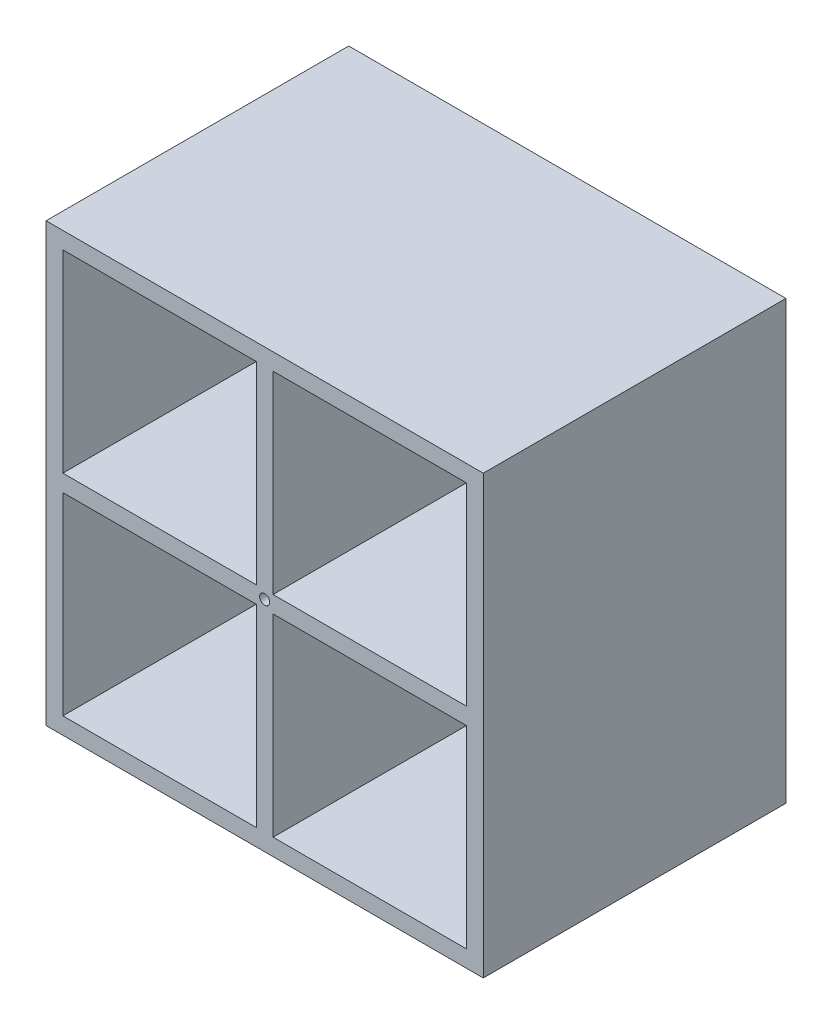
ISO-10303-21;
HEADER;
FILE_DESCRIPTION(('STEP AP214'),'2;1');
FILE_NAME('part.step','',(''),(''),'','','');
FILE_SCHEMA(('AUTOMOTIVE_DESIGN { 1 0 10303 214 1 1 1 1 }'));
ENDSEC;
DATA;
#1=APPLICATION_CONTEXT('core data for automotive mechanical design processes');
#2=APPLICATION_PROTOCOL_DEFINITION('international standard','automotive_design',2000,#1);
#3=PRODUCT_CONTEXT('',#1,'mechanical');
#4=PRODUCT('Part','Part','',(#3));
#5=PRODUCT_RELATED_PRODUCT_CATEGORY('part','',(#4));
#6=PRODUCT_DEFINITION_FORMATION('','',#4);
#7=PRODUCT_DEFINITION_CONTEXT('part definition',#1,'design');
#8=PRODUCT_DEFINITION('design','',#6,#7);
#9=PRODUCT_DEFINITION_SHAPE('','',#8);
#10=(LENGTH_UNIT() NAMED_UNIT(*) SI_UNIT(.MILLI.,.METRE.));
#11=(NAMED_UNIT(*) PLANE_ANGLE_UNIT() SI_UNIT($,.RADIAN.));
#12=(NAMED_UNIT(*) SI_UNIT($,.STERADIAN.) SOLID_ANGLE_UNIT());
#13=UNCERTAINTY_MEASURE_WITH_UNIT(LENGTH_MEASURE(1.E-05),#10,'distance_accuracy_value','');
#14=(GEOMETRIC_REPRESENTATION_CONTEXT(3) GLOBAL_UNCERTAINTY_ASSIGNED_CONTEXT((#13)) GLOBAL_UNIT_ASSIGNED_CONTEXT((#10,
#11,#12)) REPRESENTATION_CONTEXT('',''));
#15=CARTESIAN_POINT('',(0.,0.,0.));
#16=DIRECTION('',(0.,0.,1.));
#17=DIRECTION('',(1.,0.,0.));
#18=AXIS2_PLACEMENT_3D('',#15,#16,#17);
#19=CARTESIAN_POINT('',(65.,65.,90.));
#20=DIRECTION('',(-1.,0.,0.));
#21=DIRECTION('',(0.,-1.,0.));
#22=AXIS2_PLACEMENT_3D('',#19,#20,#21);
#23=PLANE('',#22);
#24=DIRECTION('',(0.,1.,0.));
#25=VECTOR('',#24,1.);
#26=CARTESIAN_POINT('',(65.,65.,0.));
#27=LINE('',#26,#25);
#28=CARTESIAN_POINT('',(65.,-65.,0.));
#29=VERTEX_POINT('',#28);
#30=CARTESIAN_POINT('',(65.,65.,0.));
#31=VERTEX_POINT('',#30);
#32=EDGE_CURVE('E301',#29,#31,#27,.T.);
#33=ORIENTED_EDGE('',*,*,#32,.T.);
#34=DIRECTION('',(0.,0.,-1.));
#35=VECTOR('',#34,1.);
#36=CARTESIAN_POINT('',(65.,65.,90.));
#37=LINE('',#36,#35);
#38=CARTESIAN_POINT('',(65.,65.,90.));
#39=VERTEX_POINT('',#38);
#40=EDGE_CURVE('E11',#39,#31,#37,.T.);
#41=ORIENTED_EDGE('',*,*,#40,.F.);
#42=DIRECTION('',(0.,1.,0.));
#43=VECTOR('',#42,1.);
#44=CARTESIAN_POINT('',(65.,65.,90.));
#45=LINE('',#44,#43);
#46=CARTESIAN_POINT('',(65.,-65.,90.));
#47=VERTEX_POINT('',#46);
#48=EDGE_CURVE('E308',#47,#39,#45,.T.);
#49=ORIENTED_EDGE('',*,*,#48,.F.);
#50=DIRECTION('',(0.,0.,-1.));
#51=VECTOR('',#50,1.);
#52=CARTESIAN_POINT('',(65.,-65.,90.));
#53=LINE('',#52,#51);
#54=EDGE_CURVE('E318',#47,#29,#53,.T.);
#55=ORIENTED_EDGE('',*,*,#54,.T.);
#56=EDGE_LOOP('',(#33,#41,#49,#55));
#57=FACE_BOUND('',#56,.T.);
#58=ADVANCED_FACE('F39',(#57),#23,.F.);
#59=CARTESIAN_POINT('',(-65.,65.,90.));
#60=DIRECTION('',(0.,-1.,0.));
#61=DIRECTION('',(0.,0.,-1.));
#62=AXIS2_PLACEMENT_3D('',#59,#60,#61);
#63=PLANE('',#62);
#64=DIRECTION('',(-1.,0.,0.));
#65=VECTOR('',#64,1.);
#66=CARTESIAN_POINT('',(-65.,65.,0.));
#67=LINE('',#66,#65);
#68=CARTESIAN_POINT('',(-65.,65.,0.));
#69=VERTEX_POINT('',#68);
#70=EDGE_CURVE('E321',#31,#69,#67,.T.);
#71=ORIENTED_EDGE('',*,*,#70,.T.);
#72=DIRECTION('',(0.,0.,-1.));
#73=VECTOR('',#72,1.);
#74=CARTESIAN_POINT('',(-65.,65.,90.));
#75=LINE('',#74,#73);
#76=CARTESIAN_POINT('',(-65.,65.,90.));
#77=VERTEX_POINT('',#76);
#78=EDGE_CURVE('E46',#77,#69,#75,.T.);
#79=ORIENTED_EDGE('',*,*,#78,.F.);
#80=DIRECTION('',(-1.,0.,0.));
#81=VECTOR('',#80,1.);
#82=CARTESIAN_POINT('',(-65.,65.,90.));
#83=LINE('',#82,#81);
#84=EDGE_CURVE('E311',#39,#77,#83,.T.);
#85=ORIENTED_EDGE('',*,*,#84,.F.);
#86=ORIENTED_EDGE('',*,*,#40,.T.);
#87=EDGE_LOOP('',(#71,#79,#85,#86));
#88=FACE_BOUND('',#87,.T.);
#89=ADVANCED_FACE('F350',(#88),#63,.F.);
#90=CARTESIAN_POINT('',(-65.,65.,90.));
#91=DIRECTION('',(1.,0.,0.));
#92=DIRECTION('',(0.,1.,0.));
#93=AXIS2_PLACEMENT_3D('',#90,#91,#92);
#94=PLANE('',#93);
#95=DIRECTION('',(0.,-1.,0.));
#96=VECTOR('',#95,1.);
#97=CARTESIAN_POINT('',(-65.,65.,0.));
#98=LINE('',#97,#96);
#99=CARTESIAN_POINT('',(-65.,-65.,0.));
#100=VERTEX_POINT('',#99);
#101=EDGE_CURVE('E323',#69,#100,#98,.T.);
#102=ORIENTED_EDGE('',*,*,#101,.T.);
#103=DIRECTION('',(0.,0.,-1.));
#104=VECTOR('',#103,1.);
#105=CARTESIAN_POINT('',(-65.,-65.,90.));
#106=LINE('',#105,#104);
#107=CARTESIAN_POINT('',(-65.,-65.,90.));
#108=VERTEX_POINT('',#107);
#109=EDGE_CURVE('E328',#108,#100,#106,.T.);
#110=ORIENTED_EDGE('',*,*,#109,.F.);
#111=DIRECTION('',(0.,-1.,0.));
#112=VECTOR('',#111,1.);
#113=CARTESIAN_POINT('',(-65.,65.,90.));
#114=LINE('',#113,#112);
#115=EDGE_CURVE('E314',#77,#108,#114,.T.);
#116=ORIENTED_EDGE('',*,*,#115,.F.);
#117=ORIENTED_EDGE('',*,*,#78,.T.);
#118=EDGE_LOOP('',(#102,#110,#116,#117));
#119=FACE_BOUND('',#118,.T.);
#120=ADVANCED_FACE('F335',(#119),#94,.F.);
#121=CARTESIAN_POINT('',(-65.,-65.,90.));
#122=DIRECTION('',(0.,1.,0.));
#123=DIRECTION('',(0.,0.,1.));
#124=AXIS2_PLACEMENT_3D('',#121,#122,#123);
#125=PLANE('',#124);
#126=DIRECTION('',(1.,0.,0.));
#127=VECTOR('',#126,1.);
#128=CARTESIAN_POINT('',(-65.,-65.,0.));
#129=LINE('',#128,#127);
#130=EDGE_CURVE('E312',#100,#29,#129,.T.);
#131=ORIENTED_EDGE('',*,*,#130,.T.);
#132=ORIENTED_EDGE('',*,*,#54,.F.);
#133=DIRECTION('',(1.,0.,0.));
#134=VECTOR('',#133,1.);
#135=CARTESIAN_POINT('',(-65.,-65.,90.));
#136=LINE('',#135,#134);
#137=EDGE_CURVE('E316',#108,#47,#136,.T.);
#138=ORIENTED_EDGE('',*,*,#137,.F.);
#139=ORIENTED_EDGE('',*,*,#109,.T.);
#140=EDGE_LOOP('',(#131,#132,#138,#139));
#141=FACE_BOUND('',#140,.T.);
#142=ADVANCED_FACE('F344',(#141),#125,.F.);
#143=CARTESIAN_POINT('',(0.,0.,90.));
#144=DIRECTION('',(0.,0.,1.));
#145=DIRECTION('',(1.,0.,0.));
#146=AXIS2_PLACEMENT_3D('',#143,#144,#145);
#147=PLANE('',#146);
#148=CARTESIAN_POINT('',(0.,0.,90.));
#149=DIRECTION('',(0.,0.,1.));
#150=DIRECTION('',(1.,0.,0.));
#151=AXIS2_PLACEMENT_3D('',#148,#149,#150);
#152=CIRCLE('',#151,1.5);
#153=CARTESIAN_POINT('',(1.5,0.,90.));
#154=VERTEX_POINT('',#153);
#155=EDGE_CURVE('E434',#154,#154,#152,.T.);
#156=ORIENTED_EDGE('',*,*,#155,.F.);
#157=EDGE_LOOP('',(#156));
#158=FACE_BOUND('',#157,.T.);
#159=DIRECTION('',(0.,-1.,0.));
#160=VECTOR('',#159,1.);
#161=CARTESIAN_POINT('',(2.50000000000003,2.5,90.));
#162=LINE('',#161,#160);
#163=CARTESIAN_POINT('',(2.50000000000003,60.,90.));
#164=VERTEX_POINT('',#163);
#165=CARTESIAN_POINT('',(2.50000000000003,2.5,90.));
#166=VERTEX_POINT('',#165);
#167=EDGE_CURVE('E53',#164,#166,#162,.T.);
#168=ORIENTED_EDGE('',*,*,#167,.F.);
#169=DIRECTION('',(-1.,0.,0.));
#170=VECTOR('',#169,1.);
#171=CARTESIAN_POINT('',(2.50000000000003,60.,90.));
#172=LINE('',#171,#170);
#173=CARTESIAN_POINT('',(60.,60.,90.));
#174=VERTEX_POINT('',#173);
#175=EDGE_CURVE('E227',#174,#164,#172,.T.);
#176=ORIENTED_EDGE('',*,*,#175,.F.);
#177=DIRECTION('',(0.,1.,0.));
#178=VECTOR('',#177,1.);
#179=CARTESIAN_POINT('',(60.,2.5,90.));
#180=LINE('',#179,#178);
#181=CARTESIAN_POINT('',(60.,2.5,90.));
#182=VERTEX_POINT('',#181);
#183=EDGE_CURVE('E230',#182,#174,#180,.T.);
#184=ORIENTED_EDGE('',*,*,#183,.F.);
#185=DIRECTION('',(1.,0.,0.));
#186=VECTOR('',#185,1.);
#187=CARTESIAN_POINT('',(2.50000000000003,2.5,90.));
#188=LINE('',#187,#186);
#189=EDGE_CURVE('E234',#166,#182,#188,.T.);
#190=ORIENTED_EDGE('',*,*,#189,.F.);
#191=EDGE_LOOP('',(#168,#176,#184,#190));
#192=FACE_BOUND('',#191,.T.);
#193=DIRECTION('',(0.,-1.,0.));
#194=VECTOR('',#193,1.);
#195=CARTESIAN_POINT('',(-60.,-60.,90.));
#196=LINE('',#195,#194);
#197=CARTESIAN_POINT('',(-60.,-2.50000000000002,90.));
#198=VERTEX_POINT('',#197);
#199=CARTESIAN_POINT('',(-60.,-60.,90.));
#200=VERTEX_POINT('',#199);
#201=EDGE_CURVE('E61',#198,#200,#196,.T.);
#202=ORIENTED_EDGE('',*,*,#201,.F.);
#203=DIRECTION('',(-1.,0.,0.));
#204=VECTOR('',#203,1.);
#205=CARTESIAN_POINT('',(-60.,-2.50000000000002,90.));
#206=LINE('',#205,#204);
#207=CARTESIAN_POINT('',(-2.50000000000003,-2.50000000000002,90.));
#208=VERTEX_POINT('',#207);
#209=EDGE_CURVE('E255',#208,#198,#206,.T.);
#210=ORIENTED_EDGE('',*,*,#209,.F.);
#211=DIRECTION('',(0.,1.,0.));
#212=VECTOR('',#211,1.);
#213=CARTESIAN_POINT('',(-2.50000000000003,-60.,90.));
#214=LINE('',#213,#212);
#215=CARTESIAN_POINT('',(-2.50000000000003,-60.,90.));
#216=VERTEX_POINT('',#215);
#217=EDGE_CURVE('E258',#216,#208,#214,.T.);
#218=ORIENTED_EDGE('',*,*,#217,.F.);
#219=DIRECTION('',(1.,0.,0.));
#220=VECTOR('',#219,1.);
#221=CARTESIAN_POINT('',(-60.,-60.,90.));
#222=LINE('',#221,#220);
#223=EDGE_CURVE('E262',#200,#216,#222,.T.);
#224=ORIENTED_EDGE('',*,*,#223,.F.);
#225=EDGE_LOOP('',(#202,#210,#218,#224));
#226=FACE_BOUND('',#225,.T.);
#227=DIRECTION('',(0.,-1.,0.));
#228=VECTOR('',#227,1.);
#229=CARTESIAN_POINT('',(2.50000000000003,-60.,90.));
#230=LINE('',#229,#228);
#231=CARTESIAN_POINT('',(2.50000000000003,-2.50000000000002,90.));
#232=VERTEX_POINT('',#231);
#233=CARTESIAN_POINT('',(2.50000000000003,-60.,90.));
#234=VERTEX_POINT('',#233);
#235=EDGE_CURVE('E178',#232,#234,#230,.T.);
#236=ORIENTED_EDGE('',*,*,#235,.F.);
#237=DIRECTION('',(-1.,0.,0.));
#238=VECTOR('',#237,1.);
#239=CARTESIAN_POINT('',(2.50000000000003,-2.50000000000002,90.));
#240=LINE('',#239,#238);
#241=CARTESIAN_POINT('',(60.,-2.50000000000002,90.));
#242=VERTEX_POINT('',#241);
#243=EDGE_CURVE('E189',#242,#232,#240,.T.);
#244=ORIENTED_EDGE('',*,*,#243,.F.);
#245=DIRECTION('',(0.,1.,0.));
#246=VECTOR('',#245,1.);
#247=CARTESIAN_POINT('',(60.,-60.,90.));
#248=LINE('',#247,#246);
#249=CARTESIAN_POINT('',(60.,-60.,90.));
#250=VERTEX_POINT('',#249);
#251=EDGE_CURVE('E194',#250,#242,#248,.T.);
#252=ORIENTED_EDGE('',*,*,#251,.F.);
#253=DIRECTION('',(1.,0.,0.));
#254=VECTOR('',#253,1.);
#255=CARTESIAN_POINT('',(2.50000000000003,-60.,90.));
#256=LINE('',#255,#254);
#257=EDGE_CURVE('E200',#234,#250,#256,.T.);
#258=ORIENTED_EDGE('',*,*,#257,.F.);
#259=EDGE_LOOP('',(#236,#244,#252,#258));
#260=FACE_BOUND('',#259,.T.);
#261=DIRECTION('',(0.,-1.,0.));
#262=VECTOR('',#261,1.);
#263=CARTESIAN_POINT('',(-60.,2.5,90.));
#264=LINE('',#263,#262);
#265=CARTESIAN_POINT('',(-60.,60.,90.));
#266=VERTEX_POINT('',#265);
#267=CARTESIAN_POINT('',(-60.,2.5,90.));
#268=VERTEX_POINT('',#267);
#269=EDGE_CURVE('E238',#266,#268,#264,.T.);
#270=ORIENTED_EDGE('',*,*,#269,.F.);
#271=DIRECTION('',(-1.,0.,0.));
#272=VECTOR('',#271,1.);
#273=CARTESIAN_POINT('',(-60.,60.,90.));
#274=LINE('',#273,#272);
#275=CARTESIAN_POINT('',(-2.50000000000003,60.,90.));
#276=VERTEX_POINT('',#275);
#277=EDGE_CURVE('E280',#276,#266,#274,.T.);
#278=ORIENTED_EDGE('',*,*,#277,.F.);
#279=DIRECTION('',(0.,1.,0.));
#280=VECTOR('',#279,1.);
#281=CARTESIAN_POINT('',(-2.50000000000003,2.5,90.));
#282=LINE('',#281,#280);
#283=CARTESIAN_POINT('',(-2.50000000000003,2.5,90.));
#284=VERTEX_POINT('',#283);
#285=EDGE_CURVE('E294',#284,#276,#282,.T.);
#286=ORIENTED_EDGE('',*,*,#285,.F.);
#287=DIRECTION('',(1.,0.,0.));
#288=VECTOR('',#287,1.);
#289=CARTESIAN_POINT('',(-60.,2.5,90.));
#290=LINE('',#289,#288);
#291=EDGE_CURVE('E291',#268,#284,#290,.T.);
#292=ORIENTED_EDGE('',*,*,#291,.F.);
#293=EDGE_LOOP('',(#270,#278,#286,#292));
#294=FACE_BOUND('',#293,.T.);
#295=ORIENTED_EDGE('',*,*,#48,.T.);
#296=ORIENTED_EDGE('',*,*,#84,.T.);
#297=ORIENTED_EDGE('',*,*,#115,.T.);
#298=ORIENTED_EDGE('',*,*,#137,.T.);
#299=EDGE_LOOP('',(#295,#296,#297,#298));
#300=FACE_BOUND('',#299,.T.);
#301=ADVANCED_FACE('F197',(#158,#192,#226,#260,#294,#300),#147,.T.);
#302=CARTESIAN_POINT('',(0.,0.,0.));
#303=DIRECTION('',(0.,0.,1.));
#304=DIRECTION('',(1.,0.,0.));
#305=AXIS2_PLACEMENT_3D('',#302,#303,#304);
#306=PLANE('',#305);
#307=CARTESIAN_POINT('',(0.,0.,0.));
#308=DIRECTION('',(0.,0.,1.));
#309=DIRECTION('',(1.,0.,0.));
#310=AXIS2_PLACEMENT_3D('',#307,#308,#309);
#311=CIRCLE('',#310,1.5);
#312=CARTESIAN_POINT('',(1.5,0.,0.));
#313=VERTEX_POINT('',#312);
#314=EDGE_CURVE('E186',#313,#313,#311,.T.);
#315=ORIENTED_EDGE('',*,*,#314,.T.);
#316=EDGE_LOOP('',(#315));
#317=FACE_BOUND('',#316,.T.);
#318=DIRECTION('',(-1.,0.,0.));
#319=VECTOR('',#318,1.);
#320=CARTESIAN_POINT('',(2.50000000000003,60.,0.));
#321=LINE('',#320,#319);
#322=CARTESIAN_POINT('',(60.,60.,0.));
#323=VERTEX_POINT('',#322);
#324=CARTESIAN_POINT('',(2.50000000000003,60.,0.));
#325=VERTEX_POINT('',#324);
#326=EDGE_CURVE('E220',#323,#325,#321,.T.);
#327=ORIENTED_EDGE('',*,*,#326,.T.);
#328=DIRECTION('',(0.,-1.,0.));
#329=VECTOR('',#328,1.);
#330=CARTESIAN_POINT('',(2.50000000000003,2.5,0.));
#331=LINE('',#330,#329);
#332=CARTESIAN_POINT('',(2.50000000000003,2.5,0.));
#333=VERTEX_POINT('',#332);
#334=EDGE_CURVE('E231',#325,#333,#331,.T.);
#335=ORIENTED_EDGE('',*,*,#334,.T.);
#336=DIRECTION('',(1.,0.,0.));
#337=VECTOR('',#336,1.);
#338=CARTESIAN_POINT('',(2.50000000000003,2.5,0.));
#339=LINE('',#338,#337);
#340=CARTESIAN_POINT('',(60.,2.5,0.));
#341=VERTEX_POINT('',#340);
#342=EDGE_CURVE('E244',#333,#341,#339,.T.);
#343=ORIENTED_EDGE('',*,*,#342,.T.);
#344=DIRECTION('',(0.,1.,0.));
#345=VECTOR('',#344,1.);
#346=CARTESIAN_POINT('',(60.,2.5,0.));
#347=LINE('',#346,#345);
#348=EDGE_CURVE('E241',#341,#323,#347,.T.);
#349=ORIENTED_EDGE('',*,*,#348,.T.);
#350=EDGE_LOOP('',(#327,#335,#343,#349));
#351=FACE_BOUND('',#350,.T.);
#352=DIRECTION('',(-1.,0.,0.));
#353=VECTOR('',#352,1.);
#354=CARTESIAN_POINT('',(-60.,-2.50000000000002,0.));
#355=LINE('',#354,#353);
#356=CARTESIAN_POINT('',(-2.50000000000003,-2.50000000000002,0.));
#357=VERTEX_POINT('',#356);
#358=CARTESIAN_POINT('',(-60.,-2.50000000000002,0.));
#359=VERTEX_POINT('',#358);
#360=EDGE_CURVE('E251',#357,#359,#355,.T.);
#361=ORIENTED_EDGE('',*,*,#360,.T.);
#362=DIRECTION('',(0.,-1.,0.));
#363=VECTOR('',#362,1.);
#364=CARTESIAN_POINT('',(-60.,-60.,0.));
#365=LINE('',#364,#363);
#366=CARTESIAN_POINT('',(-60.,-60.,0.));
#367=VERTEX_POINT('',#366);
#368=EDGE_CURVE('E259',#359,#367,#365,.T.);
#369=ORIENTED_EDGE('',*,*,#368,.T.);
#370=DIRECTION('',(1.,0.,0.));
#371=VECTOR('',#370,1.);
#372=CARTESIAN_POINT('',(-60.,-60.,0.));
#373=LINE('',#372,#371);
#374=CARTESIAN_POINT('',(-2.50000000000003,-60.,0.));
#375=VERTEX_POINT('',#374);
#376=EDGE_CURVE('E271',#367,#375,#373,.T.);
#377=ORIENTED_EDGE('',*,*,#376,.T.);
#378=DIRECTION('',(0.,1.,0.));
#379=VECTOR('',#378,1.);
#380=CARTESIAN_POINT('',(-2.50000000000003,-60.,0.));
#381=LINE('',#380,#379);
#382=EDGE_CURVE('E268',#375,#357,#381,.T.);
#383=ORIENTED_EDGE('',*,*,#382,.T.);
#384=EDGE_LOOP('',(#361,#369,#377,#383));
#385=FACE_BOUND('',#384,.T.);
#386=DIRECTION('',(-1.,0.,0.));
#387=VECTOR('',#386,1.);
#388=CARTESIAN_POINT('',(2.50000000000003,-2.50000000000002,0.));
#389=LINE('',#388,#387);
#390=CARTESIAN_POINT('',(60.,-2.50000000000002,0.));
#391=VERTEX_POINT('',#390);
#392=CARTESIAN_POINT('',(2.50000000000003,-2.50000000000002,0.));
#393=VERTEX_POINT('',#392);
#394=EDGE_CURVE('E208',#391,#393,#389,.T.);
#395=ORIENTED_EDGE('',*,*,#394,.T.);
#396=DIRECTION('',(0.,-1.,0.));
#397=VECTOR('',#396,1.);
#398=CARTESIAN_POINT('',(2.50000000000003,-60.,0.));
#399=LINE('',#398,#397);
#400=CARTESIAN_POINT('',(2.50000000000003,-60.,0.));
#401=VERTEX_POINT('',#400);
#402=EDGE_CURVE('E181',#393,#401,#399,.T.);
#403=ORIENTED_EDGE('',*,*,#402,.T.);
#404=DIRECTION('',(1.,0.,0.));
#405=VECTOR('',#404,1.);
#406=CARTESIAN_POINT('',(2.50000000000003,-60.,0.));
#407=LINE('',#406,#405);
#408=CARTESIAN_POINT('',(60.,-60.,0.));
#409=VERTEX_POINT('',#408);
#410=EDGE_CURVE('E214',#401,#409,#407,.T.);
#411=ORIENTED_EDGE('',*,*,#410,.T.);
#412=DIRECTION('',(0.,1.,0.));
#413=VECTOR('',#412,1.);
#414=CARTESIAN_POINT('',(60.,-60.,0.));
#415=LINE('',#414,#413);
#416=EDGE_CURVE('E210',#409,#391,#415,.T.);
#417=ORIENTED_EDGE('',*,*,#416,.T.);
#418=EDGE_LOOP('',(#395,#403,#411,#417));
#419=FACE_BOUND('',#418,.T.);
#420=DIRECTION('',(-1.,0.,0.));
#421=VECTOR('',#420,1.);
#422=CARTESIAN_POINT('',(-60.,60.,0.));
#423=LINE('',#422,#421);
#424=CARTESIAN_POINT('',(-2.50000000000003,60.,0.));
#425=VERTEX_POINT('',#424);
#426=CARTESIAN_POINT('',(-60.,60.,0.));
#427=VERTEX_POINT('',#426);
#428=EDGE_CURVE('E286',#425,#427,#423,.T.);
#429=ORIENTED_EDGE('',*,*,#428,.T.);
#430=DIRECTION('',(0.,-1.,0.));
#431=VECTOR('',#430,1.);
#432=CARTESIAN_POINT('',(-60.,2.5,0.));
#433=LINE('',#432,#431);
#434=CARTESIAN_POINT('',(-60.,2.5,0.));
#435=VERTEX_POINT('',#434);
#436=EDGE_CURVE('E276',#427,#435,#433,.T.);
#437=ORIENTED_EDGE('',*,*,#436,.T.);
#438=DIRECTION('',(1.,0.,0.));
#439=VECTOR('',#438,1.);
#440=CARTESIAN_POINT('',(-60.,2.5,0.));
#441=LINE('',#440,#439);
#442=CARTESIAN_POINT('',(-2.50000000000003,2.5,0.));
#443=VERTEX_POINT('',#442);
#444=EDGE_CURVE('E279',#435,#443,#441,.T.);
#445=ORIENTED_EDGE('',*,*,#444,.T.);
#446=DIRECTION('',(0.,1.,0.));
#447=VECTOR('',#446,1.);
#448=CARTESIAN_POINT('',(-2.50000000000003,2.5,0.));
#449=LINE('',#448,#447);
#450=EDGE_CURVE('E283',#443,#425,#449,.T.);
#451=ORIENTED_EDGE('',*,*,#450,.T.);
#452=EDGE_LOOP('',(#429,#437,#445,#451));
#453=FACE_BOUND('',#452,.T.);
#454=ORIENTED_EDGE('',*,*,#32,.F.);
#455=ORIENTED_EDGE('',*,*,#130,.F.);
#456=ORIENTED_EDGE('',*,*,#101,.F.);
#457=ORIENTED_EDGE('',*,*,#70,.F.);
#458=EDGE_LOOP('',(#454,#455,#456,#457));
#459=FACE_BOUND('',#458,.T.);
#460=ADVANCED_FACE('F341',(#317,#351,#385,#419,#453,#459),#306,.F.);
#461=CARTESIAN_POINT('',(-60.,2.5,0.));
#462=DIRECTION('',(-1.,0.,0.));
#463=DIRECTION('',(0.,0.,1.));
#464=AXIS2_PLACEMENT_3D('',#461,#462,#463);
#465=PLANE('',#464);
#466=ORIENTED_EDGE('',*,*,#269,.T.);
#467=DIRECTION('',(0.,0.,1.));
#468=VECTOR('',#467,1.);
#469=CARTESIAN_POINT('',(-60.,2.5,0.));
#470=LINE('',#469,#468);
#471=EDGE_CURVE('E289',#435,#268,#470,.T.);
#472=ORIENTED_EDGE('',*,*,#471,.F.);
#473=ORIENTED_EDGE('',*,*,#436,.F.);
#474=DIRECTION('',(0.,0.,1.));
#475=VECTOR('',#474,1.);
#476=CARTESIAN_POINT('',(-60.,60.,0.));
#477=LINE('',#476,#475);
#478=EDGE_CURVE('E299',#427,#266,#477,.T.);
#479=ORIENTED_EDGE('',*,*,#478,.T.);
#480=EDGE_LOOP('',(#466,#472,#473,#479));
#481=FACE_BOUND('',#480,.T.);
#482=ADVANCED_FACE('F362',(#481),#465,.F.);
#483=CARTESIAN_POINT('',(-60.,60.,0.));
#484=DIRECTION('',(0.,1.,0.));
#485=DIRECTION('',(-1.,0.,0.));
#486=AXIS2_PLACEMENT_3D('',#483,#484,#485);
#487=PLANE('',#486);
#488=ORIENTED_EDGE('',*,*,#277,.T.);
#489=ORIENTED_EDGE('',*,*,#478,.F.);
#490=ORIENTED_EDGE('',*,*,#428,.F.);
#491=DIRECTION('',(0.,0.,1.));
#492=VECTOR('',#491,1.);
#493=CARTESIAN_POINT('',(-2.50000000000003,60.,0.));
#494=LINE('',#493,#492);
#495=EDGE_CURVE('E302',#425,#276,#494,.T.);
#496=ORIENTED_EDGE('',*,*,#495,.T.);
#497=EDGE_LOOP('',(#488,#489,#490,#496));
#498=FACE_BOUND('',#497,.T.);
#499=ADVANCED_FACE('F369',(#498),#487,.F.);
#500=CARTESIAN_POINT('',(-2.50000000000003,2.5,0.));
#501=DIRECTION('',(1.,0.,0.));
#502=DIRECTION('',(0.,0.,-1.));
#503=AXIS2_PLACEMENT_3D('',#500,#501,#502);
#504=PLANE('',#503);
#505=ORIENTED_EDGE('',*,*,#285,.T.);
#506=ORIENTED_EDGE('',*,*,#495,.F.);
#507=ORIENTED_EDGE('',*,*,#450,.F.);
#508=DIRECTION('',(0.,0.,1.));
#509=VECTOR('',#508,1.);
#510=CARTESIAN_POINT('',(-2.50000000000003,2.5,0.));
#511=LINE('',#510,#509);
#512=EDGE_CURVE('E304',#443,#284,#511,.T.);
#513=ORIENTED_EDGE('',*,*,#512,.T.);
#514=EDGE_LOOP('',(#505,#506,#507,#513));
#515=FACE_BOUND('',#514,.T.);
#516=ADVANCED_FACE('F374',(#515),#504,.F.);
#517=CARTESIAN_POINT('',(-60.,2.5,0.));
#518=DIRECTION('',(0.,-1.,0.));
#519=DIRECTION('',(1.,0.,0.));
#520=AXIS2_PLACEMENT_3D('',#517,#518,#519);
#521=PLANE('',#520);
#522=ORIENTED_EDGE('',*,*,#291,.T.);
#523=ORIENTED_EDGE('',*,*,#512,.F.);
#524=ORIENTED_EDGE('',*,*,#444,.F.);
#525=ORIENTED_EDGE('',*,*,#471,.T.);
#526=EDGE_LOOP('',(#522,#523,#524,#525));
#527=FACE_BOUND('',#526,.T.);
#528=ADVANCED_FACE('F371',(#527),#521,.F.);
#529=CARTESIAN_POINT('',(2.50000000000003,-60.,0.));
#530=DIRECTION('',(-1.,0.,0.));
#531=DIRECTION('',(0.,0.,1.));
#532=AXIS2_PLACEMENT_3D('',#529,#530,#531);
#533=PLANE('',#532);
#534=ORIENTED_EDGE('',*,*,#235,.T.);
#535=DIRECTION('',(0.,0.,1.));
#536=VECTOR('',#535,1.);
#537=CARTESIAN_POINT('',(2.50000000000003,-60.,0.));
#538=LINE('',#537,#536);
#539=EDGE_CURVE('E211',#401,#234,#538,.T.);
#540=ORIENTED_EDGE('',*,*,#539,.F.);
#541=ORIENTED_EDGE('',*,*,#402,.F.);
#542=DIRECTION('',(0.,0.,1.));
#543=VECTOR('',#542,1.);
#544=CARTESIAN_POINT('',(2.50000000000003,-2.50000000000002,0.));
#545=LINE('',#544,#543);
#546=EDGE_CURVE('E174',#393,#232,#545,.T.);
#547=ORIENTED_EDGE('',*,*,#546,.T.);
#548=EDGE_LOOP('',(#534,#540,#541,#547));
#549=FACE_BOUND('',#548,.T.);
#550=ADVANCED_FACE('F176',(#549),#533,.F.);
#551=CARTESIAN_POINT('',(2.50000000000003,-2.50000000000002,0.));
#552=DIRECTION('',(0.,1.,0.));
#553=DIRECTION('',(0.,0.,1.));
#554=AXIS2_PLACEMENT_3D('',#551,#552,#553);
#555=PLANE('',#554);
#556=ORIENTED_EDGE('',*,*,#243,.T.);
#557=ORIENTED_EDGE('',*,*,#546,.F.);
#558=ORIENTED_EDGE('',*,*,#394,.F.);
#559=DIRECTION('',(0.,0.,1.));
#560=VECTOR('',#559,1.);
#561=CARTESIAN_POINT('',(60.,-2.50000000000002,0.));
#562=LINE('',#561,#560);
#563=EDGE_CURVE('E185',#391,#242,#562,.T.);
#564=ORIENTED_EDGE('',*,*,#563,.T.);
#565=EDGE_LOOP('',(#556,#557,#558,#564));
#566=FACE_BOUND('',#565,.T.);
#567=ADVANCED_FACE('F190',(#566),#555,.F.);
#568=CARTESIAN_POINT('',(60.,-60.,0.));
#569=DIRECTION('',(1.,0.,0.));
#570=DIRECTION('',(0.,0.,-1.));
#571=AXIS2_PLACEMENT_3D('',#568,#569,#570);
#572=PLANE('',#571);
#573=ORIENTED_EDGE('',*,*,#251,.T.);
#574=ORIENTED_EDGE('',*,*,#563,.F.);
#575=ORIENTED_EDGE('',*,*,#416,.F.);
#576=DIRECTION('',(0.,0.,1.));
#577=VECTOR('',#576,1.);
#578=CARTESIAN_POINT('',(60.,-60.,0.));
#579=LINE('',#578,#577);
#580=EDGE_CURVE('E439',#409,#250,#579,.T.);
#581=ORIENTED_EDGE('',*,*,#580,.T.);
#582=EDGE_LOOP('',(#573,#574,#575,#581));
#583=FACE_BOUND('',#582,.T.);
#584=ADVANCED_FACE('F416',(#583),#572,.F.);
#585=CARTESIAN_POINT('',(2.50000000000003,-60.,0.));
#586=DIRECTION('',(0.,-1.,0.));
#587=DIRECTION('',(0.,0.,-1.));
#588=AXIS2_PLACEMENT_3D('',#585,#586,#587);
#589=PLANE('',#588);
#590=ORIENTED_EDGE('',*,*,#257,.T.);
#591=ORIENTED_EDGE('',*,*,#580,.F.);
#592=ORIENTED_EDGE('',*,*,#410,.F.);
#593=ORIENTED_EDGE('',*,*,#539,.T.);
#594=EDGE_LOOP('',(#590,#591,#592,#593));
#595=FACE_BOUND('',#594,.T.);
#596=ADVANCED_FACE('F398',(#595),#589,.F.);
#597=CARTESIAN_POINT('',(-60.,-60.,0.));
#598=DIRECTION('',(-1.,0.,0.));
#599=DIRECTION('',(0.,0.,1.));
#600=AXIS2_PLACEMENT_3D('',#597,#598,#599);
#601=PLANE('',#600);
#602=ORIENTED_EDGE('',*,*,#201,.T.);
#603=DIRECTION('',(0.,0.,1.));
#604=VECTOR('',#603,1.);
#605=CARTESIAN_POINT('',(-60.,-60.,0.));
#606=LINE('',#605,#604);
#607=EDGE_CURVE('E249',#367,#200,#606,.T.);
#608=ORIENTED_EDGE('',*,*,#607,.F.);
#609=ORIENTED_EDGE('',*,*,#368,.F.);
#610=DIRECTION('',(0.,0.,1.));
#611=VECTOR('',#610,1.);
#612=CARTESIAN_POINT('',(-60.,-2.50000000000002,0.));
#613=LINE('',#612,#611);
#614=EDGE_CURVE('E201',#359,#198,#613,.T.);
#615=ORIENTED_EDGE('',*,*,#614,.T.);
#616=EDGE_LOOP('',(#602,#608,#609,#615));
#617=FACE_BOUND('',#616,.T.);
#618=ADVANCED_FACE('F386',(#617),#601,.F.);
#619=CARTESIAN_POINT('',(-60.,-2.50000000000002,0.));
#620=DIRECTION('',(0.,1.,0.));
#621=DIRECTION('',(0.,0.,1.));
#622=AXIS2_PLACEMENT_3D('',#619,#620,#621);
#623=PLANE('',#622);
#624=ORIENTED_EDGE('',*,*,#209,.T.);
#625=ORIENTED_EDGE('',*,*,#614,.F.);
#626=ORIENTED_EDGE('',*,*,#360,.F.);
#627=DIRECTION('',(0.,0.,1.));
#628=VECTOR('',#627,1.);
#629=CARTESIAN_POINT('',(-2.50000000000003,-2.50000000000002,0.));
#630=LINE('',#629,#628);
#631=EDGE_CURVE('E203',#357,#208,#630,.T.);
#632=ORIENTED_EDGE('',*,*,#631,.T.);
#633=EDGE_LOOP('',(#624,#625,#626,#632));
#634=FACE_BOUND('',#633,.T.);
#635=ADVANCED_FACE('F382',(#634),#623,.F.);
#636=CARTESIAN_POINT('',(-2.50000000000003,-60.,0.));
#637=DIRECTION('',(1.,0.,0.));
#638=DIRECTION('',(0.,0.,-1.));
#639=AXIS2_PLACEMENT_3D('',#636,#637,#638);
#640=PLANE('',#639);
#641=ORIENTED_EDGE('',*,*,#217,.T.);
#642=ORIENTED_EDGE('',*,*,#631,.F.);
#643=ORIENTED_EDGE('',*,*,#382,.F.);
#644=DIRECTION('',(0.,0.,1.));
#645=VECTOR('',#644,1.);
#646=CARTESIAN_POINT('',(-2.50000000000003,-60.,0.));
#647=LINE('',#646,#645);
#648=EDGE_CURVE('E252',#375,#216,#647,.T.);
#649=ORIENTED_EDGE('',*,*,#648,.T.);
#650=EDGE_LOOP('',(#641,#642,#643,#649));
#651=FACE_BOUND('',#650,.T.);
#652=ADVANCED_FACE('F385',(#651),#640,.F.);
#653=CARTESIAN_POINT('',(-60.,-60.,0.));
#654=DIRECTION('',(0.,-1.,0.));
#655=DIRECTION('',(0.,0.,-1.));
#656=AXIS2_PLACEMENT_3D('',#653,#654,#655);
#657=PLANE('',#656);
#658=ORIENTED_EDGE('',*,*,#223,.T.);
#659=ORIENTED_EDGE('',*,*,#648,.F.);
#660=ORIENTED_EDGE('',*,*,#376,.F.);
#661=ORIENTED_EDGE('',*,*,#607,.T.);
#662=EDGE_LOOP('',(#658,#659,#660,#661));
#663=FACE_BOUND('',#662,.T.);
#664=ADVANCED_FACE('F390',(#663),#657,.F.);
#665=CARTESIAN_POINT('',(2.50000000000003,2.5,0.));
#666=DIRECTION('',(-1.,0.,0.));
#667=DIRECTION('',(0.,0.,1.));
#668=AXIS2_PLACEMENT_3D('',#665,#666,#667);
#669=PLANE('',#668);
#670=ORIENTED_EDGE('',*,*,#167,.T.);
#671=DIRECTION('',(0.,0.,1.));
#672=VECTOR('',#671,1.);
#673=CARTESIAN_POINT('',(2.50000000000003,2.5,0.));
#674=LINE('',#673,#672);
#675=EDGE_CURVE('E218',#333,#166,#674,.T.);
#676=ORIENTED_EDGE('',*,*,#675,.F.);
#677=ORIENTED_EDGE('',*,*,#334,.F.);
#678=DIRECTION('',(0.,0.,1.));
#679=VECTOR('',#678,1.);
#680=CARTESIAN_POINT('',(2.50000000000003,60.,0.));
#681=LINE('',#680,#679);
#682=EDGE_CURVE('E225',#325,#164,#681,.T.);
#683=ORIENTED_EDGE('',*,*,#682,.T.);
#684=EDGE_LOOP('',(#670,#676,#677,#683));
#685=FACE_BOUND('',#684,.T.);
#686=ADVANCED_FACE('F394',(#685),#669,.F.);
#687=CARTESIAN_POINT('',(2.50000000000003,60.,0.));
#688=DIRECTION('',(0.,1.,0.));
#689=DIRECTION('',(0.,0.,1.));
#690=AXIS2_PLACEMENT_3D('',#687,#688,#689);
#691=PLANE('',#690);
#692=ORIENTED_EDGE('',*,*,#175,.T.);
#693=ORIENTED_EDGE('',*,*,#682,.F.);
#694=ORIENTED_EDGE('',*,*,#326,.F.);
#695=DIRECTION('',(0.,0.,1.));
#696=VECTOR('',#695,1.);
#697=CARTESIAN_POINT('',(60.,60.,0.));
#698=LINE('',#697,#696);
#699=EDGE_CURVE('E223',#323,#174,#698,.T.);
#700=ORIENTED_EDGE('',*,*,#699,.T.);
#701=EDGE_LOOP('',(#692,#693,#694,#700));
#702=FACE_BOUND('',#701,.T.);
#703=ADVANCED_FACE('F399',(#702),#691,.F.);
#704=CARTESIAN_POINT('',(60.,2.5,0.));
#705=DIRECTION('',(1.,0.,0.));
#706=DIRECTION('',(0.,0.,-1.));
#707=AXIS2_PLACEMENT_3D('',#704,#705,#706);
#708=PLANE('',#707);
#709=ORIENTED_EDGE('',*,*,#183,.T.);
#710=ORIENTED_EDGE('',*,*,#699,.F.);
#711=ORIENTED_EDGE('',*,*,#348,.F.);
#712=DIRECTION('',(0.,0.,1.));
#713=VECTOR('',#712,1.);
#714=CARTESIAN_POINT('',(60.,2.5,0.));
#715=LINE('',#714,#713);
#716=EDGE_CURVE('E221',#341,#182,#715,.T.);
#717=ORIENTED_EDGE('',*,*,#716,.T.);
#718=EDGE_LOOP('',(#709,#710,#711,#717));
#719=FACE_BOUND('',#718,.T.);
#720=ADVANCED_FACE('F402',(#719),#708,.F.);
#721=CARTESIAN_POINT('',(2.50000000000003,2.5,0.));
#722=DIRECTION('',(0.,-1.,0.));
#723=DIRECTION('',(0.,0.,-1.));
#724=AXIS2_PLACEMENT_3D('',#721,#722,#723);
#725=PLANE('',#724);
#726=ORIENTED_EDGE('',*,*,#189,.T.);
#727=ORIENTED_EDGE('',*,*,#716,.F.);
#728=ORIENTED_EDGE('',*,*,#342,.F.);
#729=ORIENTED_EDGE('',*,*,#675,.T.);
#730=EDGE_LOOP('',(#726,#727,#728,#729));
#731=FACE_BOUND('',#730,.T.);
#732=ADVANCED_FACE('F406',(#731),#725,.F.);
#733=CARTESIAN_POINT('',(0.,0.,0.));
#734=DIRECTION('',(0.,0.,1.));
#735=DIRECTION('',(1.,0.,0.));
#736=AXIS2_PLACEMENT_3D('',#733,#734,#735);
#737=CYLINDRICAL_SURFACE('',#736,1.5);
#738=CARTESIAN_POINT('',(1.5,0.,0.));
#739=CARTESIAN_POINT('',(1.5,0.,0.937499999999998));
#740=CARTESIAN_POINT('',(1.5,0.,1.875));
#741=CARTESIAN_POINT('',(1.5,0.,3.75));
#742=CARTESIAN_POINT('',(1.5,0.,4.6875));
#743=CARTESIAN_POINT('',(1.5,0.,6.5625));
#744=CARTESIAN_POINT('',(1.5,0.,7.5));
#745=CARTESIAN_POINT('',(1.5,0.,9.375));
#746=CARTESIAN_POINT('',(1.5,0.,10.3125));
#747=CARTESIAN_POINT('',(1.5,0.,12.1875));
#748=CARTESIAN_POINT('',(1.5,0.,13.125));
#749=CARTESIAN_POINT('',(1.5,0.,15.));
#750=CARTESIAN_POINT('',(1.5,0.,15.9375));
#751=CARTESIAN_POINT('',(1.5,0.,17.8125));
#752=CARTESIAN_POINT('',(1.5,0.,18.75));
#753=CARTESIAN_POINT('',(1.5,0.,20.625));
#754=CARTESIAN_POINT('',(1.5,0.,21.5625));
#755=CARTESIAN_POINT('',(1.5,0.,23.4375));
#756=CARTESIAN_POINT('',(1.5,0.,24.375));
#757=CARTESIAN_POINT('',(1.5,0.,26.25));
#758=CARTESIAN_POINT('',(1.5,0.,27.1875));
#759=CARTESIAN_POINT('',(1.5,0.,29.0625));
#760=CARTESIAN_POINT('',(1.5,0.,30.));
#761=CARTESIAN_POINT('',(1.5,0.,31.875));
#762=CARTESIAN_POINT('',(1.5,0.,32.8125));
#763=CARTESIAN_POINT('',(1.5,0.,34.6875));
#764=CARTESIAN_POINT('',(1.5,0.,35.625));
#765=CARTESIAN_POINT('',(1.5,0.,37.5));
#766=CARTESIAN_POINT('',(1.5,0.,38.4375));
#767=CARTESIAN_POINT('',(1.5,0.,40.3125));
#768=CARTESIAN_POINT('',(1.5,0.,41.25));
#769=CARTESIAN_POINT('',(1.5,0.,43.125));
#770=CARTESIAN_POINT('',(1.5,0.,44.0625));
#771=CARTESIAN_POINT('',(1.5,0.,45.9375));
#772=CARTESIAN_POINT('',(1.5,0.,46.875));
#773=CARTESIAN_POINT('',(1.5,0.,48.75));
#774=CARTESIAN_POINT('',(1.5,0.,49.6875));
#775=CARTESIAN_POINT('',(1.5,0.,51.5625));
#776=CARTESIAN_POINT('',(1.5,0.,52.5));
#777=CARTESIAN_POINT('',(1.5,0.,54.375));
#778=CARTESIAN_POINT('',(1.5,0.,55.3125));
#779=CARTESIAN_POINT('',(1.5,0.,57.1875));
#780=CARTESIAN_POINT('',(1.5,0.,58.125));
#781=CARTESIAN_POINT('',(1.5,0.,60.));
#782=CARTESIAN_POINT('',(1.5,0.,60.9375));
#783=CARTESIAN_POINT('',(1.5,0.,62.8125));
#784=CARTESIAN_POINT('',(1.5,0.,63.75));
#785=CARTESIAN_POINT('',(1.5,0.,65.625));
#786=CARTESIAN_POINT('',(1.5,0.,66.5625));
#787=CARTESIAN_POINT('',(1.5,0.,68.4375));
#788=CARTESIAN_POINT('',(1.5,0.,69.375));
#789=CARTESIAN_POINT('',(1.5,0.,71.25));
#790=CARTESIAN_POINT('',(1.5,0.,72.1875));
#791=CARTESIAN_POINT('',(1.5,0.,74.0625));
#792=CARTESIAN_POINT('',(1.5,0.,75.));
#793=CARTESIAN_POINT('',(1.5,0.,76.875));
#794=CARTESIAN_POINT('',(1.5,0.,77.8125));
#795=CARTESIAN_POINT('',(1.5,0.,79.6875));
#796=CARTESIAN_POINT('',(1.5,0.,80.625));
#797=CARTESIAN_POINT('',(1.5,0.,82.5));
#798=CARTESIAN_POINT('',(1.5,0.,83.4375));
#799=CARTESIAN_POINT('',(1.5,0.,85.3125));
#800=CARTESIAN_POINT('',(1.5,0.,86.25));
#801=CARTESIAN_POINT('',(1.5,0.,88.125));
#802=CARTESIAN_POINT('',(1.5,0.,89.0625));
#803=CARTESIAN_POINT('',(1.5,0.,90.));
#804=B_SPLINE_CURVE_WITH_KNOTS('',3,(#738,#739,#740,#741,#742,#743,#744,#745,#746,#747,#748,
#749,#750,#751,#752,#753,#754,#755,#756,#757,#758,#759,#760,#761,#762,#763,#764,#765,#766,#767,
#768,#769,#770,#771,#772,#773,#774,#775,#776,#777,#778,#779,#780,#781,#782,#783,#784,#785,#786,
#787,#788,#789,#790,#791,#792,#793,#794,#795,#796,#797,#798,#799,#800,#801,#802,#803),
.UNSPECIFIED.,.F.,.F.,(4,2,2,2,2,2,2,2,2,2,2,2,2,2,2,2,2,2,2,2,2,2,2,2,2,2,2,2,2,2,2,2,4),(0.,
2.8125,5.625,8.4375,11.25,14.0625,16.875,19.6875,22.5,25.3125,28.125,30.9375,33.75,36.5625,
39.375,42.1875,45.,47.8125,50.625,53.4375,56.25,59.0625,61.875,64.6875,67.5,70.3125,73.125,
75.9375,78.75,81.5625,84.375,87.1875,90.),.UNSPECIFIED.);
#805=EDGE_CURVE('BSEAM410',#313,#154,#804,.T.);
#806=ORIENTED_EDGE('',*,*,#314,.F.);
#807=ORIENTED_EDGE('',*,*,#155,.T.);
#808=ORIENTED_EDGE('',*,*,#805,.T.);
#809=ORIENTED_EDGE('',*,*,#805,.F.);
#810=EDGE_LOOP('',(#806,#808,#807,#809));
#811=FACE_BOUND('',#810,.T.);
#812=ADVANCED_FACE('F410',(#811),#737,.F.);
#813=CLOSED_SHELL('',(#58,#89,#120,#142,#301,#460,#482,#499,#516,#528,#550,#567,#584,#596,#618,
#635,#652,#664,#686,#703,#720,#732,#812));
#814=MANIFOLD_SOLID_BREP('B2',#813);
#815=ADVANCED_BREP_SHAPE_REPRESENTATION('',(#18,#814),#14);
#816=SHAPE_DEFINITION_REPRESENTATION(#9,#815);
ENDSEC;
END-ISO-10303-21;
